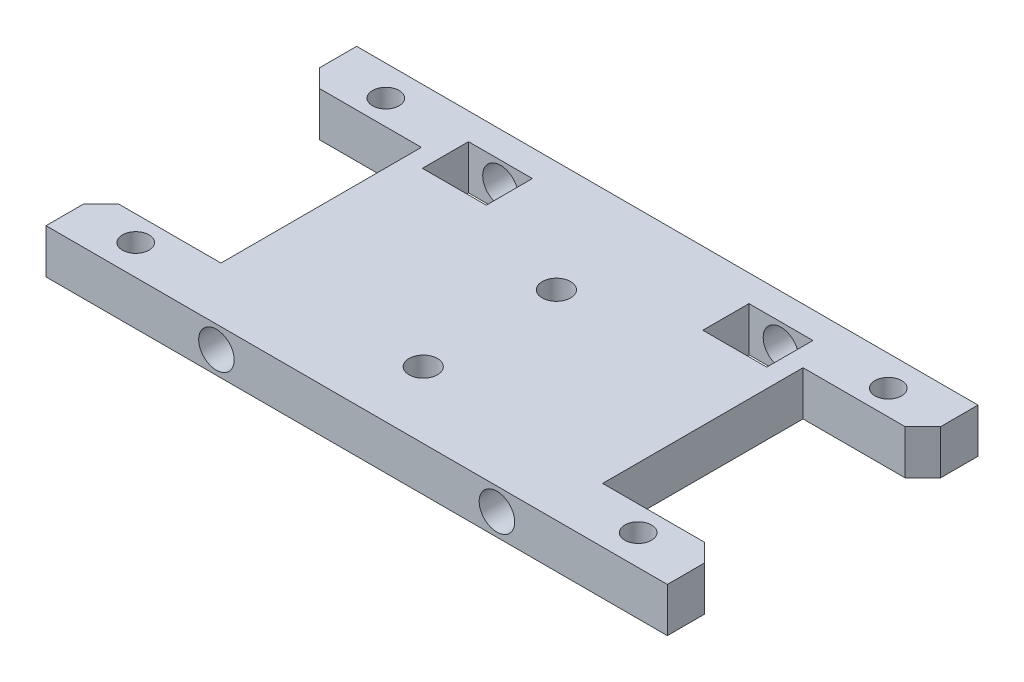
ISO-10303-21;
HEADER;
FILE_DESCRIPTION(('STEP AP214'),'2;1');
FILE_NAME('part.step','',(''),(''),'','','');
FILE_SCHEMA(('AUTOMOTIVE_DESIGN { 1 0 10303 214 1 1 1 1 }'));
ENDSEC;
DATA;
#1=APPLICATION_CONTEXT('core data for automotive mechanical design processes');
#2=APPLICATION_PROTOCOL_DEFINITION('international standard','automotive_design',2000,#1);
#3=PRODUCT_CONTEXT('',#1,'mechanical');
#4=PRODUCT('Part','Part','',(#3));
#5=PRODUCT_RELATED_PRODUCT_CATEGORY('part','',(#4));
#6=PRODUCT_DEFINITION_FORMATION('','',#4);
#7=PRODUCT_DEFINITION_CONTEXT('part definition',#1,'design');
#8=PRODUCT_DEFINITION('design','',#6,#7);
#9=PRODUCT_DEFINITION_SHAPE('','',#8);
#10=(LENGTH_UNIT() NAMED_UNIT(*) SI_UNIT(.MILLI.,.METRE.));
#11=(NAMED_UNIT(*) PLANE_ANGLE_UNIT() SI_UNIT($,.RADIAN.));
#12=(NAMED_UNIT(*) SI_UNIT($,.STERADIAN.) SOLID_ANGLE_UNIT());
#13=UNCERTAINTY_MEASURE_WITH_UNIT(LENGTH_MEASURE(1.E-05),#10,'distance_accuracy_value','');
#14=(GEOMETRIC_REPRESENTATION_CONTEXT(3) GLOBAL_UNCERTAINTY_ASSIGNED_CONTEXT((#13)) GLOBAL_UNIT_ASSIGNED_CONTEXT((#10,
#11,#12)) REPRESENTATION_CONTEXT('',''));
#15=CARTESIAN_POINT('',(0.,0.,0.));
#16=DIRECTION('',(0.,0.,1.));
#17=DIRECTION('',(1.,0.,0.));
#18=AXIS2_PLACEMENT_3D('',#15,#16,#17);
#19=CARTESIAN_POINT('',(-15.8,2.5,-17.5));
#20=DIRECTION('',(0.,0.,1.));
#21=DIRECTION('',(1.,0.,0.));
#22=AXIS2_PLACEMENT_3D('',#19,#20,#21);
#23=CYLINDRICAL_SURFACE('',#22,2.);
#24=CARTESIAN_POINT('',(-15.8,2.5,-9.3));
#25=DIRECTION('',(0.,0.,1.));
#26=DIRECTION('',(1.,0.,0.));
#27=AXIS2_PLACEMENT_3D('',#24,#25,#26);
#28=CIRCLE('',#27,2.);
#29=CARTESIAN_POINT('',(-13.8,2.5,-9.3));
#30=VERTEX_POINT('',#29);
#31=EDGE_CURVE('E43',#30,#30,#28,.F.);
#32=ORIENTED_EDGE('',*,*,#31,.T.);
#33=EDGE_LOOP('',(#32));
#34=FACE_BOUND('',#33,.T.);
#35=CARTESIAN_POINT('',(-15.8,2.5,17.5));
#36=DIRECTION('',(0.,0.,1.));
#37=DIRECTION('',(1.,0.,0.));
#38=AXIS2_PLACEMENT_3D('',#35,#36,#37);
#39=CIRCLE('',#38,2.);
#40=CARTESIAN_POINT('',(-13.8,2.5,17.5));
#41=VERTEX_POINT('',#40);
#42=EDGE_CURVE('E279',#41,#41,#39,.T.);
#43=ORIENTED_EDGE('',*,*,#42,.T.);
#44=EDGE_LOOP('',(#43));
#45=FACE_BOUND('',#44,.T.);
#46=ADVANCED_FACE('F38',(#34,#45),#23,.F.);
#47=CARTESIAN_POINT('',(15.8,2.5,-17.5));
#48=DIRECTION('',(0.,0.,1.));
#49=DIRECTION('',(1.,0.,0.));
#50=AXIS2_PLACEMENT_3D('',#47,#48,#49);
#51=CYLINDRICAL_SURFACE('',#50,2.);
#52=CARTESIAN_POINT('',(15.8,2.5,-9.3));
#53=DIRECTION('',(0.,0.,1.));
#54=DIRECTION('',(1.,0.,0.));
#55=AXIS2_PLACEMENT_3D('',#52,#53,#54);
#56=CIRCLE('',#55,2.);
#57=CARTESIAN_POINT('',(17.8,2.5,-9.3));
#58=VERTEX_POINT('',#57);
#59=EDGE_CURVE('E438',#58,#58,#56,.T.);
#60=ORIENTED_EDGE('',*,*,#59,.F.);
#61=EDGE_LOOP('',(#60));
#62=FACE_BOUND('',#61,.T.);
#63=CARTESIAN_POINT('',(15.8,2.5,17.5));
#64=DIRECTION('',(0.,0.,-1.));
#65=DIRECTION('',(-1.,0.,0.));
#66=AXIS2_PLACEMENT_3D('',#63,#64,#65);
#67=CIRCLE('',#66,2.);
#68=CARTESIAN_POINT('',(13.8,2.5,17.5));
#69=VERTEX_POINT('',#68);
#70=EDGE_CURVE('E276',#69,#69,#67,.T.);
#71=ORIENTED_EDGE('',*,*,#70,.F.);
#72=EDGE_LOOP('',(#71));
#73=FACE_BOUND('',#72,.T.);
#74=ADVANCED_FACE('F464',(#62,#73),#51,.F.);
#75=CARTESIAN_POINT('',(0.,5.,-17.5));
#76=DIRECTION('',(0.,0.,-1.));
#77=DIRECTION('',(-1.,0.,0.));
#78=AXIS2_PLACEMENT_3D('',#75,#76,#77);
#79=PLANE('',#78);
#80=DIRECTION('',(1.,0.,0.));
#81=VECTOR('',#80,1.);
#82=CARTESIAN_POINT('',(0.,0.,-17.5));
#83=LINE('',#82,#81);
#84=CARTESIAN_POINT('',(-35.,0.,-17.5));
#85=VERTEX_POINT('',#84);
#86=CARTESIAN_POINT('',(35.,0.,-17.5));
#87=VERTEX_POINT('',#86);
#88=EDGE_CURVE('E360',#85,#87,#83,.T.);
#89=ORIENTED_EDGE('',*,*,#88,.F.);
#90=DIRECTION('',(0.,-1.,0.));
#91=VECTOR('',#90,1.);
#92=CARTESIAN_POINT('',(-35.,5.,-17.5));
#93=LINE('',#92,#91);
#94=CARTESIAN_POINT('',(-35.,5.,-17.5));
#95=VERTEX_POINT('',#94);
#96=EDGE_CURVE('E395',#95,#85,#93,.T.);
#97=ORIENTED_EDGE('',*,*,#96,.F.);
#98=DIRECTION('',(1.,0.,0.));
#99=VECTOR('',#98,1.);
#100=CARTESIAN_POINT('',(0.,5.,-17.5));
#101=LINE('',#100,#99);
#102=CARTESIAN_POINT('',(35.,5.,-17.5));
#103=VERTEX_POINT('',#102);
#104=EDGE_CURVE('E310',#95,#103,#101,.T.);
#105=ORIENTED_EDGE('',*,*,#104,.T.);
#106=DIRECTION('',(0.,-1.,0.));
#107=VECTOR('',#106,1.);
#108=CARTESIAN_POINT('',(35.,5.,-17.5));
#109=LINE('',#108,#107);
#110=EDGE_CURVE('E397',#103,#87,#109,.T.);
#111=ORIENTED_EDGE('',*,*,#110,.T.);
#112=EDGE_LOOP('',(#89,#97,#105,#111));
#113=FACE_BOUND('',#112,.T.);
#114=CARTESIAN_POINT('',(-15.8,2.5,-17.5));
#115=DIRECTION('',(0.,0.,1.));
#116=DIRECTION('',(1.,0.,0.));
#117=AXIS2_PLACEMENT_3D('',#114,#115,#116);
#118=CIRCLE('',#117,2.);
#119=CARTESIAN_POINT('',(-13.8,2.5,-17.5));
#120=VERTEX_POINT('',#119);
#121=EDGE_CURVE('E282',#120,#120,#118,.T.);
#122=ORIENTED_EDGE('',*,*,#121,.T.);
#123=EDGE_LOOP('',(#122));
#124=FACE_BOUND('',#123,.T.);
#125=CARTESIAN_POINT('',(15.8,2.5,-17.5));
#126=DIRECTION('',(0.,0.,-1.));
#127=DIRECTION('',(-1.,0.,0.));
#128=AXIS2_PLACEMENT_3D('',#125,#126,#127);
#129=CIRCLE('',#128,2.);
#130=CARTESIAN_POINT('',(13.8,2.5,-17.5));
#131=VERTEX_POINT('',#130);
#132=EDGE_CURVE('E272',#131,#131,#129,.T.);
#133=ORIENTED_EDGE('',*,*,#132,.F.);
#134=EDGE_LOOP('',(#133));
#135=FACE_BOUND('',#134,.T.);
#136=ADVANCED_FACE('F470',(#113,#124,#135),#79,.T.);
#137=CARTESIAN_POINT('',(0.,5.,17.5));
#138=DIRECTION('',(0.,0.,-1.));
#139=DIRECTION('',(-1.,0.,0.));
#140=AXIS2_PLACEMENT_3D('',#137,#138,#139);
#141=PLANE('',#140);
#142=ORIENTED_EDGE('',*,*,#42,.F.);
#143=EDGE_LOOP('',(#142));
#144=FACE_BOUND('',#143,.T.);
#145=DIRECTION('',(1.,0.,0.));
#146=VECTOR('',#145,1.);
#147=CARTESIAN_POINT('',(0.,0.,17.5));
#148=LINE('',#147,#146);
#149=CARTESIAN_POINT('',(-35.,0.,17.5));
#150=VERTEX_POINT('',#149);
#151=CARTESIAN_POINT('',(35.,0.,17.5));
#152=VERTEX_POINT('',#151);
#153=EDGE_CURVE('E377',#150,#152,#148,.T.);
#154=ORIENTED_EDGE('',*,*,#153,.T.);
#155=DIRECTION('',(0.,-1.,0.));
#156=VECTOR('',#155,1.);
#157=CARTESIAN_POINT('',(35.,5.,17.5));
#158=LINE('',#157,#156);
#159=CARTESIAN_POINT('',(35.,5.,17.5));
#160=VERTEX_POINT('',#159);
#161=EDGE_CURVE('E336',#160,#152,#158,.T.);
#162=ORIENTED_EDGE('',*,*,#161,.F.);
#163=DIRECTION('',(1.,0.,0.));
#164=VECTOR('',#163,1.);
#165=CARTESIAN_POINT('',(0.,5.,17.5));
#166=LINE('',#165,#164);
#167=CARTESIAN_POINT('',(-35.,5.,17.5));
#168=VERTEX_POINT('',#167);
#169=EDGE_CURVE('E327',#168,#160,#166,.T.);
#170=ORIENTED_EDGE('',*,*,#169,.F.);
#171=DIRECTION('',(0.,-1.,0.));
#172=VECTOR('',#171,1.);
#173=CARTESIAN_POINT('',(-35.,5.,17.5));
#174=LINE('',#173,#172);
#175=EDGE_CURVE('E387',#168,#150,#174,.T.);
#176=ORIENTED_EDGE('',*,*,#175,.T.);
#177=EDGE_LOOP('',(#154,#162,#170,#176));
#178=FACE_BOUND('',#177,.T.);
#179=ORIENTED_EDGE('',*,*,#70,.T.);
#180=EDGE_LOOP('',(#179));
#181=FACE_BOUND('',#180,.T.);
#182=ADVANCED_FACE('F489',(#144,#178,#181),#141,.F.);
#183=CARTESIAN_POINT('',(0.,5.,11.2885966736073));
#184=DIRECTION('',(0.,0.,-1.));
#185=DIRECTION('',(-1.,0.,0.));
#186=AXIS2_PLACEMENT_3D('',#183,#184,#185);
#187=PLANE('',#186);
#188=DIRECTION('',(1.,0.,0.));
#189=VECTOR('',#188,1.);
#190=CARTESIAN_POINT('',(0.,5.,11.2885966736073));
#191=LINE('',#190,#189);
#192=CARTESIAN_POINT('',(21.499999989902,5.,11.2885966736073));
#193=VERTEX_POINT('',#192);
#194=CARTESIAN_POINT('',(33.,5.,11.2885966736073));
#195=VERTEX_POINT('',#194);
#196=EDGE_CURVE('E298',#193,#195,#191,.T.);
#197=ORIENTED_EDGE('',*,*,#196,.T.);
#198=DIRECTION('',(0.,-1.,0.));
#199=VECTOR('',#198,1.);
#200=CARTESIAN_POINT('',(33.,5.,11.2885966736073));
#201=LINE('',#200,#199);
#202=CARTESIAN_POINT('',(33.,0.,11.2885966736073));
#203=VERTEX_POINT('',#202);
#204=EDGE_CURVE('E403',#195,#203,#201,.T.);
#205=ORIENTED_EDGE('',*,*,#204,.T.);
#206=DIRECTION('',(1.,0.,0.));
#207=VECTOR('',#206,1.);
#208=CARTESIAN_POINT('',(0.,0.,11.2885966736073));
#209=LINE('',#208,#207);
#210=CARTESIAN_POINT('',(21.499999989902,0.,11.2885966736073));
#211=VERTEX_POINT('',#210);
#212=EDGE_CURVE('E348',#211,#203,#209,.T.);
#213=ORIENTED_EDGE('',*,*,#212,.F.);
#214=DIRECTION('',(0.,-1.,0.));
#215=VECTOR('',#214,1.);
#216=CARTESIAN_POINT('',(21.499999989902,5.,11.2885966736073));
#217=LINE('',#216,#215);
#218=EDGE_CURVE('E401',#193,#211,#217,.T.);
#219=ORIENTED_EDGE('',*,*,#218,.F.);
#220=EDGE_LOOP('',(#197,#205,#213,#219));
#221=FACE_BOUND('',#220,.T.);
#222=ADVANCED_FACE('F497',(#221),#187,.T.);
#223=CARTESIAN_POINT('',(21.499999989902,5.,0.));
#224=DIRECTION('',(1.,0.,0.));
#225=DIRECTION('',(0.,0.,-1.));
#226=AXIS2_PLACEMENT_3D('',#223,#224,#225);
#227=PLANE('',#226);
#228=DIRECTION('',(0.,0.,1.));
#229=VECTOR('',#228,1.);
#230=CARTESIAN_POINT('',(21.499999989902,0.,0.));
#231=LINE('',#230,#229);
#232=CARTESIAN_POINT('',(21.499999989902,0.,-11.2885966736073));
#233=VERTEX_POINT('',#232);
#234=EDGE_CURVE('E351',#233,#211,#231,.T.);
#235=ORIENTED_EDGE('',*,*,#234,.F.);
#236=DIRECTION('',(0.,-1.,0.));
#237=VECTOR('',#236,1.);
#238=CARTESIAN_POINT('',(21.499999989902,5.,-11.2885966736073));
#239=LINE('',#238,#237);
#240=CARTESIAN_POINT('',(21.499999989902,5.,-11.2885966736073));
#241=VERTEX_POINT('',#240);
#242=EDGE_CURVE('E399',#241,#233,#239,.T.);
#243=ORIENTED_EDGE('',*,*,#242,.F.);
#244=DIRECTION('',(0.,0.,1.));
#245=VECTOR('',#244,1.);
#246=CARTESIAN_POINT('',(21.499999989902,5.,0.));
#247=LINE('',#246,#245);
#248=EDGE_CURVE('E301',#241,#193,#247,.T.);
#249=ORIENTED_EDGE('',*,*,#248,.T.);
#250=ORIENTED_EDGE('',*,*,#218,.T.);
#251=EDGE_LOOP('',(#235,#243,#249,#250));
#252=FACE_BOUND('',#251,.T.);
#253=ADVANCED_FACE('F509',(#252),#227,.T.);
#254=CARTESIAN_POINT('',(0.,5.,-11.2885966736073));
#255=DIRECTION('',(0.,0.,-1.));
#256=DIRECTION('',(-1.,0.,0.));
#257=AXIS2_PLACEMENT_3D('',#254,#255,#256);
#258=PLANE('',#257);
#259=DIRECTION('',(1.,0.,0.));
#260=VECTOR('',#259,1.);
#261=CARTESIAN_POINT('',(0.,0.,-11.2885966736073));
#262=LINE('',#261,#260);
#263=CARTESIAN_POINT('',(33.,0.,-11.2885966736073));
#264=VERTEX_POINT('',#263);
#265=EDGE_CURVE('E354',#233,#264,#262,.T.);
#266=ORIENTED_EDGE('',*,*,#265,.T.);
#267=DIRECTION('',(0.,1.,0.));
#268=VECTOR('',#267,1.);
#269=CARTESIAN_POINT('',(33.,5.,-11.2885966736073));
#270=LINE('',#269,#268);
#271=CARTESIAN_POINT('',(33.,5.,-11.2885966736073));
#272=VERTEX_POINT('',#271);
#273=EDGE_CURVE('E427',#264,#272,#270,.T.);
#274=ORIENTED_EDGE('',*,*,#273,.T.);
#275=DIRECTION('',(1.,0.,0.));
#276=VECTOR('',#275,1.);
#277=CARTESIAN_POINT('',(0.,5.,-11.2885966736073));
#278=LINE('',#277,#276);
#279=EDGE_CURVE('E304',#241,#272,#278,.T.);
#280=ORIENTED_EDGE('',*,*,#279,.F.);
#281=ORIENTED_EDGE('',*,*,#242,.T.);
#282=EDGE_LOOP('',(#266,#274,#280,#281));
#283=FACE_BOUND('',#282,.T.);
#284=ADVANCED_FACE('F505',(#283),#258,.F.);
#285=CARTESIAN_POINT('',(35.,5.,0.));
#286=DIRECTION('',(1.,0.,0.));
#287=DIRECTION('',(0.,0.,-1.));
#288=AXIS2_PLACEMENT_3D('',#285,#286,#287);
#289=PLANE('',#288);
#290=DIRECTION('',(0.,0.,1.));
#291=VECTOR('',#290,1.);
#292=CARTESIAN_POINT('',(35.,5.,0.));
#293=LINE('',#292,#291);
#294=CARTESIAN_POINT('',(35.,5.,-13.2885966736073));
#295=VERTEX_POINT('',#294);
#296=EDGE_CURVE('E307',#103,#295,#293,.T.);
#297=ORIENTED_EDGE('',*,*,#296,.T.);
#298=DIRECTION('',(0.,-1.,0.));
#299=VECTOR('',#298,1.);
#300=CARTESIAN_POINT('',(35.,0.,-13.2885966736073));
#301=LINE('',#300,#299);
#302=CARTESIAN_POINT('',(35.,0.,-13.2885966736073));
#303=VERTEX_POINT('',#302);
#304=EDGE_CURVE('E424',#295,#303,#301,.T.);
#305=ORIENTED_EDGE('',*,*,#304,.T.);
#306=DIRECTION('',(0.,0.,1.));
#307=VECTOR('',#306,1.);
#308=CARTESIAN_POINT('',(35.,0.,0.));
#309=LINE('',#308,#307);
#310=EDGE_CURVE('E357',#87,#303,#309,.T.);
#311=ORIENTED_EDGE('',*,*,#310,.F.);
#312=ORIENTED_EDGE('',*,*,#110,.F.);
#313=EDGE_LOOP('',(#297,#305,#311,#312));
#314=FACE_BOUND('',#313,.T.);
#315=ADVANCED_FACE('F508',(#314),#289,.T.);
#316=CARTESIAN_POINT('',(-35.,5.,0.));
#317=DIRECTION('',(1.,0.,0.));
#318=DIRECTION('',(0.,0.,-1.));
#319=AXIS2_PLACEMENT_3D('',#316,#317,#318);
#320=PLANE('',#319);
#321=DIRECTION('',(0.,0.,1.));
#322=VECTOR('',#321,1.);
#323=CARTESIAN_POINT('',(-35.,0.,0.));
#324=LINE('',#323,#322);
#325=CARTESIAN_POINT('',(-35.,0.,-13.2885966736073));
#326=VERTEX_POINT('',#325);
#327=EDGE_CURVE('E364',#85,#326,#324,.T.);
#328=ORIENTED_EDGE('',*,*,#327,.T.);
#329=DIRECTION('',(0.,1.,0.));
#330=VECTOR('',#329,1.);
#331=CARTESIAN_POINT('',(-35.,5.,-13.2885966736073));
#332=LINE('',#331,#330);
#333=CARTESIAN_POINT('',(-35.,5.,-13.2885966736073));
#334=VERTEX_POINT('',#333);
#335=EDGE_CURVE('E11',#326,#334,#332,.T.);
#336=ORIENTED_EDGE('',*,*,#335,.T.);
#337=DIRECTION('',(0.,0.,1.));
#338=VECTOR('',#337,1.);
#339=CARTESIAN_POINT('',(-35.,5.,0.));
#340=LINE('',#339,#338);
#341=EDGE_CURVE('E314',#95,#334,#340,.T.);
#342=ORIENTED_EDGE('',*,*,#341,.F.);
#343=ORIENTED_EDGE('',*,*,#96,.T.);
#344=EDGE_LOOP('',(#328,#336,#342,#343));
#345=FACE_BOUND('',#344,.T.);
#346=ADVANCED_FACE('F616',(#345),#320,.F.);
#347=CARTESIAN_POINT('',(0.,5.,-11.2885966736073));
#348=DIRECTION('',(0.,0.,1.));
#349=DIRECTION('',(1.,0.,0.));
#350=AXIS2_PLACEMENT_3D('',#347,#348,#349);
#351=PLANE('',#350);
#352=DIRECTION('',(-1.,0.,0.));
#353=VECTOR('',#352,1.);
#354=CARTESIAN_POINT('',(0.,5.,-11.2885966736073));
#355=LINE('',#354,#353);
#356=CARTESIAN_POINT('',(-21.499999989902,5.,-11.2885966736073));
#357=VERTEX_POINT('',#356);
#358=CARTESIAN_POINT('',(-33.,5.,-11.2885966736073));
#359=VERTEX_POINT('',#358);
#360=EDGE_CURVE('E317',#357,#359,#355,.T.);
#361=ORIENTED_EDGE('',*,*,#360,.T.);
#362=DIRECTION('',(0.,-1.,0.));
#363=VECTOR('',#362,1.);
#364=CARTESIAN_POINT('',(-33.,0.,-11.2885966736073));
#365=LINE('',#364,#363);
#366=CARTESIAN_POINT('',(-33.,0.,-11.2885966736073));
#367=VERTEX_POINT('',#366);
#368=EDGE_CURVE('E48',#359,#367,#365,.T.);
#369=ORIENTED_EDGE('',*,*,#368,.T.);
#370=DIRECTION('',(-1.,0.,0.));
#371=VECTOR('',#370,1.);
#372=CARTESIAN_POINT('',(0.,0.,-11.2885966736073));
#373=LINE('',#372,#371);
#374=CARTESIAN_POINT('',(-21.499999989902,0.,-11.2885966736073));
#375=VERTEX_POINT('',#374);
#376=EDGE_CURVE('E367',#375,#367,#373,.T.);
#377=ORIENTED_EDGE('',*,*,#376,.F.);
#378=DIRECTION('',(0.,-1.,0.));
#379=VECTOR('',#378,1.);
#380=CARTESIAN_POINT('',(-21.499999989902,5.,-11.2885966736073));
#381=LINE('',#380,#379);
#382=EDGE_CURVE('E393',#357,#375,#381,.T.);
#383=ORIENTED_EDGE('',*,*,#382,.F.);
#384=EDGE_LOOP('',(#361,#369,#377,#383));
#385=FACE_BOUND('',#384,.T.);
#386=ADVANCED_FACE('F503',(#385),#351,.T.);
#387=CARTESIAN_POINT('',(-21.499999989902,5.,0.));
#388=DIRECTION('',(1.,0.,0.));
#389=DIRECTION('',(0.,0.,-1.));
#390=AXIS2_PLACEMENT_3D('',#387,#388,#389);
#391=PLANE('',#390);
#392=DIRECTION('',(0.,0.,1.));
#393=VECTOR('',#392,1.);
#394=CARTESIAN_POINT('',(-21.499999989902,0.,0.));
#395=LINE('',#394,#393);
#396=CARTESIAN_POINT('',(-21.499999989902,0.,11.2885966736073));
#397=VERTEX_POINT('',#396);
#398=EDGE_CURVE('E371',#375,#397,#395,.T.);
#399=ORIENTED_EDGE('',*,*,#398,.T.);
#400=DIRECTION('',(0.,-1.,0.));
#401=VECTOR('',#400,1.);
#402=CARTESIAN_POINT('',(-21.499999989902,5.,11.2885966736073));
#403=LINE('',#402,#401);
#404=CARTESIAN_POINT('',(-21.499999989902,5.,11.2885966736073));
#405=VERTEX_POINT('',#404);
#406=EDGE_CURVE('E390',#405,#397,#403,.T.);
#407=ORIENTED_EDGE('',*,*,#406,.F.);
#408=DIRECTION('',(0.,0.,1.));
#409=VECTOR('',#408,1.);
#410=CARTESIAN_POINT('',(-21.499999989902,5.,0.));
#411=LINE('',#410,#409);
#412=EDGE_CURVE('E321',#357,#405,#411,.T.);
#413=ORIENTED_EDGE('',*,*,#412,.F.);
#414=ORIENTED_EDGE('',*,*,#382,.T.);
#415=EDGE_LOOP('',(#399,#407,#413,#414));
#416=FACE_BOUND('',#415,.T.);
#417=ADVANCED_FACE('F604',(#416),#391,.F.);
#418=CARTESIAN_POINT('',(0.,5.,11.2885966736073));
#419=DIRECTION('',(0.,0.,1.));
#420=DIRECTION('',(1.,0.,0.));
#421=AXIS2_PLACEMENT_3D('',#418,#419,#420);
#422=PLANE('',#421);
#423=DIRECTION('',(-1.,0.,0.));
#424=VECTOR('',#423,1.);
#425=CARTESIAN_POINT('',(0.,0.,11.2885966736073));
#426=LINE('',#425,#424);
#427=CARTESIAN_POINT('',(-33.,0.,11.2885966736073));
#428=VERTEX_POINT('',#427);
#429=EDGE_CURVE('E374',#397,#428,#426,.T.);
#430=ORIENTED_EDGE('',*,*,#429,.T.);
#431=DIRECTION('',(0.,1.,0.));
#432=VECTOR('',#431,1.);
#433=CARTESIAN_POINT('',(-33.,5.,11.2885966736073));
#434=LINE('',#433,#432);
#435=CARTESIAN_POINT('',(-33.,5.,11.2885966736073));
#436=VERTEX_POINT('',#435);
#437=EDGE_CURVE('E432',#428,#436,#434,.T.);
#438=ORIENTED_EDGE('',*,*,#437,.T.);
#439=DIRECTION('',(-1.,0.,0.));
#440=VECTOR('',#439,1.);
#441=CARTESIAN_POINT('',(0.,5.,11.2885966736073));
#442=LINE('',#441,#440);
#443=EDGE_CURVE('E324',#405,#436,#442,.T.);
#444=ORIENTED_EDGE('',*,*,#443,.F.);
#445=ORIENTED_EDGE('',*,*,#406,.T.);
#446=EDGE_LOOP('',(#430,#438,#444,#445));
#447=FACE_BOUND('',#446,.T.);
#448=ADVANCED_FACE('F607',(#447),#422,.F.);
#449=CARTESIAN_POINT('',(-35.,5.,13.2885966736073));
#450=VERTEX_POINT('',#449);
#451=EDGE_CURVE('E318',#450,#168,#340,.T.);
#452=ORIENTED_EDGE('',*,*,#451,.F.);
#453=DIRECTION('',(0.,-1.,0.));
#454=VECTOR('',#453,1.);
#455=CARTESIAN_POINT('',(-35.,5.,13.2885966736073));
#456=LINE('',#455,#454);
#457=CARTESIAN_POINT('',(-35.,0.,13.2885966736073));
#458=VERTEX_POINT('',#457);
#459=EDGE_CURVE('E429',#450,#458,#456,.T.);
#460=ORIENTED_EDGE('',*,*,#459,.T.);
#461=EDGE_CURVE('E368',#458,#150,#324,.T.);
#462=ORIENTED_EDGE('',*,*,#461,.T.);
#463=ORIENTED_EDGE('',*,*,#175,.F.);
#464=EDGE_LOOP('',(#452,#460,#462,#463));
#465=FACE_BOUND('',#464,.T.);
#466=ADVANCED_FACE('F566',(#465),#320,.F.);
#467=CARTESIAN_POINT('',(28.3037275007649,5.,14.0885966736073));
#468=DIRECTION('',(0.,-1.,0.));
#469=DIRECTION('',(0.,0.,-1.));
#470=AXIS2_PLACEMENT_3D('',#467,#468,#469);
#471=CYLINDRICAL_SURFACE('',#470,1.5);
#472=CARTESIAN_POINT('',(28.3037275007649,5.,14.0885966736073));
#473=DIRECTION('',(0.,1.,0.));
#474=DIRECTION('',(0.,0.,1.));
#475=AXIS2_PLACEMENT_3D('',#472,#473,#474);
#476=CIRCLE('',#475,1.5);
#477=CARTESIAN_POINT('',(28.3037275007649,5.,15.5885966736073));
#478=VERTEX_POINT('',#477);
#479=EDGE_CURVE('E330',#478,#478,#476,.T.);
#480=ORIENTED_EDGE('',*,*,#479,.T.);
#481=EDGE_LOOP('',(#480));
#482=FACE_BOUND('',#481,.T.);
#483=CARTESIAN_POINT('',(28.3037275007649,0.,14.0885966736073));
#484=DIRECTION('',(0.,1.,0.));
#485=DIRECTION('',(0.,0.,1.));
#486=AXIS2_PLACEMENT_3D('',#483,#484,#485);
#487=CIRCLE('',#486,1.5);
#488=CARTESIAN_POINT('',(28.3037275007649,0.,15.5885966736073));
#489=VERTEX_POINT('',#488);
#490=EDGE_CURVE('E380',#489,#489,#487,.T.);
#491=ORIENTED_EDGE('',*,*,#490,.F.);
#492=EDGE_LOOP('',(#491));
#493=FACE_BOUND('',#492,.T.);
#494=ADVANCED_FACE('F614',(#482,#493),#471,.F.);
#495=CARTESIAN_POINT('',(35.,0.,13.2885966736073));
#496=VERTEX_POINT('',#495);
#497=EDGE_CURVE('E361',#496,#152,#309,.T.);
#498=ORIENTED_EDGE('',*,*,#497,.F.);
#499=DIRECTION('',(0.,1.,0.));
#500=VECTOR('',#499,1.);
#501=CARTESIAN_POINT('',(35.,5.,13.2885966736073));
#502=LINE('',#501,#500);
#503=CARTESIAN_POINT('',(35.,5.,13.2885966736073));
#504=VERTEX_POINT('',#503);
#505=EDGE_CURVE('E414',#496,#504,#502,.T.);
#506=ORIENTED_EDGE('',*,*,#505,.T.);
#507=EDGE_CURVE('E311',#504,#160,#293,.T.);
#508=ORIENTED_EDGE('',*,*,#507,.T.);
#509=ORIENTED_EDGE('',*,*,#161,.T.);
#510=EDGE_LOOP('',(#498,#506,#508,#509));
#511=FACE_BOUND('',#510,.T.);
#512=ADVANCED_FACE('F521',(#511),#289,.T.);
#513=CARTESIAN_POINT('',(-28.3037275007649,5.,-14.0885966736073));
#514=DIRECTION('',(0.,-1.,0.));
#515=DIRECTION('',(0.,0.,-1.));
#516=AXIS2_PLACEMENT_3D('',#513,#514,#515);
#517=CYLINDRICAL_SURFACE('',#516,1.5);
#518=CARTESIAN_POINT('',(-28.3037275007649,5.,-14.0885966736073));
#519=DIRECTION('',(0.,1.,0.));
#520=DIRECTION('',(0.,0.,1.));
#521=AXIS2_PLACEMENT_3D('',#518,#519,#520);
#522=CIRCLE('',#521,1.5);
#523=CARTESIAN_POINT('',(-28.3037275007649,5.,-12.5885966736073));
#524=VERTEX_POINT('',#523);
#525=EDGE_CURVE('E295',#524,#524,#522,.T.);
#526=ORIENTED_EDGE('',*,*,#525,.T.);
#527=EDGE_LOOP('',(#526));
#528=FACE_BOUND('',#527,.T.);
#529=CARTESIAN_POINT('',(-28.3037275007649,0.,-14.0885966736073));
#530=DIRECTION('',(0.,1.,0.));
#531=DIRECTION('',(0.,0.,1.));
#532=AXIS2_PLACEMENT_3D('',#529,#530,#531);
#533=CIRCLE('',#532,1.5);
#534=CARTESIAN_POINT('',(-28.3037275007649,0.,-12.5885966736073));
#535=VERTEX_POINT('',#534);
#536=EDGE_CURVE('E345',#535,#535,#533,.T.);
#537=ORIENTED_EDGE('',*,*,#536,.F.);
#538=EDGE_LOOP('',(#537));
#539=FACE_BOUND('',#538,.T.);
#540=ADVANCED_FACE('F517',(#528,#539),#517,.F.);
#541=CARTESIAN_POINT('',(-28.3037275007649,5.,14.0885966736073));
#542=DIRECTION('',(0.,-1.,0.));
#543=DIRECTION('',(0.,0.,-1.));
#544=AXIS2_PLACEMENT_3D('',#541,#542,#543);
#545=CYLINDRICAL_SURFACE('',#544,1.5);
#546=CARTESIAN_POINT('',(-28.3037275007649,5.,14.0885966736073));
#547=DIRECTION('',(0.,1.,0.));
#548=DIRECTION('',(0.,0.,1.));
#549=AXIS2_PLACEMENT_3D('',#546,#547,#548);
#550=CIRCLE('',#549,1.5);
#551=CARTESIAN_POINT('',(-28.3037275007649,5.,15.5885966736073));
#552=VERTEX_POINT('',#551);
#553=EDGE_CURVE('E292',#552,#552,#550,.F.);
#554=ORIENTED_EDGE('',*,*,#553,.F.);
#555=EDGE_LOOP('',(#554));
#556=FACE_BOUND('',#555,.T.);
#557=CARTESIAN_POINT('',(-28.3037275007649,0.,14.0885966736073));
#558=DIRECTION('',(0.,1.,0.));
#559=DIRECTION('',(0.,0.,1.));
#560=AXIS2_PLACEMENT_3D('',#557,#558,#559);
#561=CIRCLE('',#560,1.5);
#562=CARTESIAN_POINT('',(-28.3037275007649,0.,15.5885966736073));
#563=VERTEX_POINT('',#562);
#564=EDGE_CURVE('E342',#563,#563,#561,.F.);
#565=ORIENTED_EDGE('',*,*,#564,.T.);
#566=EDGE_LOOP('',(#565));
#567=FACE_BOUND('',#566,.T.);
#568=ADVANCED_FACE('F520',(#556,#567),#545,.F.);
#569=CARTESIAN_POINT('',(0.,5.,10.));
#570=DIRECTION('',(0.,-1.,0.));
#571=DIRECTION('',(0.,0.,-1.));
#572=AXIS2_PLACEMENT_3D('',#569,#570,#571);
#573=CYLINDRICAL_SURFACE('',#572,1.6);
#574=CARTESIAN_POINT('',(0.,5.,10.));
#575=DIRECTION('',(0.,1.,0.));
#576=DIRECTION('',(0.,0.,1.));
#577=AXIS2_PLACEMENT_3D('',#574,#575,#576);
#578=CIRCLE('',#577,1.6);
#579=CARTESIAN_POINT('',(0.,5.,11.6));
#580=VERTEX_POINT('',#579);
#581=EDGE_CURVE('E288',#580,#580,#578,.T.);
#582=ORIENTED_EDGE('',*,*,#581,.T.);
#583=EDGE_LOOP('',(#582));
#584=FACE_BOUND('',#583,.T.);
#585=CARTESIAN_POINT('',(0.,0.,10.));
#586=DIRECTION('',(0.,1.,0.));
#587=DIRECTION('',(0.,0.,1.));
#588=AXIS2_PLACEMENT_3D('',#585,#586,#587);
#589=CIRCLE('',#588,1.6);
#590=CARTESIAN_POINT('',(0.,0.,11.6));
#591=VERTEX_POINT('',#590);
#592=EDGE_CURVE('E339',#591,#591,#589,.T.);
#593=ORIENTED_EDGE('',*,*,#592,.F.);
#594=EDGE_LOOP('',(#593));
#595=FACE_BOUND('',#594,.T.);
#596=ADVANCED_FACE('F525',(#584,#595),#573,.F.);
#597=CARTESIAN_POINT('',(0.,5.,-5.));
#598=DIRECTION('',(0.,-1.,0.));
#599=DIRECTION('',(0.,0.,-1.));
#600=AXIS2_PLACEMENT_3D('',#597,#598,#599);
#601=CYLINDRICAL_SURFACE('',#600,1.6);
#602=CARTESIAN_POINT('',(0.,5.,-5.));
#603=DIRECTION('',(0.,1.,0.));
#604=DIRECTION('',(0.,0.,1.));
#605=AXIS2_PLACEMENT_3D('',#602,#603,#604);
#606=CIRCLE('',#605,1.6);
#607=CARTESIAN_POINT('',(0.,5.,-3.4));
#608=VERTEX_POINT('',#607);
#609=EDGE_CURVE('E285',#608,#608,#606,.T.);
#610=ORIENTED_EDGE('',*,*,#609,.T.);
#611=EDGE_LOOP('',(#610));
#612=FACE_BOUND('',#611,.T.);
#613=CARTESIAN_POINT('',(0.,0.,-5.));
#614=DIRECTION('',(0.,1.,0.));
#615=DIRECTION('',(0.,0.,1.));
#616=AXIS2_PLACEMENT_3D('',#613,#614,#615);
#617=CIRCLE('',#616,1.6);
#618=CARTESIAN_POINT('',(0.,0.,-3.4));
#619=VERTEX_POINT('',#618);
#620=EDGE_CURVE('E275',#619,#619,#617,.T.);
#621=ORIENTED_EDGE('',*,*,#620,.F.);
#622=EDGE_LOOP('',(#621));
#623=FACE_BOUND('',#622,.T.);
#624=ADVANCED_FACE('F529',(#612,#623),#601,.F.);
#625=CARTESIAN_POINT('',(28.3037275007649,5.,-14.0885966736073));
#626=DIRECTION('',(0.,-1.,0.));
#627=DIRECTION('',(0.,0.,-1.));
#628=AXIS2_PLACEMENT_3D('',#625,#626,#627);
#629=CYLINDRICAL_SURFACE('',#628,1.5);
#630=CARTESIAN_POINT('',(28.3037275007649,5.,-14.0885966736073));
#631=DIRECTION('',(0.,1.,0.));
#632=DIRECTION('',(0.,0.,1.));
#633=AXIS2_PLACEMENT_3D('',#630,#631,#632);
#634=CIRCLE('',#633,1.5);
#635=CARTESIAN_POINT('',(28.3037275007649,5.,-12.5885966736073));
#636=VERTEX_POINT('',#635);
#637=EDGE_CURVE('E333',#636,#636,#634,.F.);
#638=ORIENTED_EDGE('',*,*,#637,.F.);
#639=EDGE_LOOP('',(#638));
#640=FACE_BOUND('',#639,.T.);
#641=CARTESIAN_POINT('',(28.3037275007649,0.,-14.0885966736073));
#642=DIRECTION('',(0.,1.,0.));
#643=DIRECTION('',(0.,0.,1.));
#644=AXIS2_PLACEMENT_3D('',#641,#642,#643);
#645=CIRCLE('',#644,1.5);
#646=CARTESIAN_POINT('',(28.3037275007649,0.,-12.5885966736073));
#647=VERTEX_POINT('',#646);
#648=EDGE_CURVE('E289',#647,#647,#645,.F.);
#649=ORIENTED_EDGE('',*,*,#648,.T.);
#650=EDGE_LOOP('',(#649));
#651=FACE_BOUND('',#650,.T.);
#652=ADVANCED_FACE('F533',(#640,#651),#629,.F.);
#653=CARTESIAN_POINT('',(0.,5.,0.));
#654=DIRECTION('',(0.,1.,0.));
#655=DIRECTION('',(0.,0.,1.));
#656=AXIS2_PLACEMENT_3D('',#653,#654,#655);
#657=PLANE('',#656);
#658=DIRECTION('',(0.,0.,-1.));
#659=VECTOR('',#658,1.);
#660=CARTESIAN_POINT('',(-12.2,5.,-14.5));
#661=LINE('',#660,#659);
#662=CARTESIAN_POINT('',(-12.2,5.,-9.3));
#663=VERTEX_POINT('',#662);
#664=CARTESIAN_POINT('',(-12.2,5.,-14.5));
#665=VERTEX_POINT('',#664);
#666=EDGE_CURVE('E56',#663,#665,#661,.T.);
#667=ORIENTED_EDGE('',*,*,#666,.F.);
#668=DIRECTION('',(1.,0.,0.));
#669=VECTOR('',#668,1.);
#670=CARTESIAN_POINT('',(-19.4,5.,-9.3));
#671=LINE('',#670,#669);
#672=CARTESIAN_POINT('',(-19.4,5.,-9.3));
#673=VERTEX_POINT('',#672);
#674=EDGE_CURVE('E223',#673,#663,#671,.T.);
#675=ORIENTED_EDGE('',*,*,#674,.F.);
#676=DIRECTION('',(0.,0.,1.));
#677=VECTOR('',#676,1.);
#678=CARTESIAN_POINT('',(-19.4,5.,-14.5));
#679=LINE('',#678,#677);
#680=CARTESIAN_POINT('',(-19.4,5.,-14.5));
#681=VERTEX_POINT('',#680);
#682=EDGE_CURVE('E226',#681,#673,#679,.T.);
#683=ORIENTED_EDGE('',*,*,#682,.F.);
#684=DIRECTION('',(-1.,0.,0.));
#685=VECTOR('',#684,1.);
#686=CARTESIAN_POINT('',(-19.4,5.,-14.5));
#687=LINE('',#686,#685);
#688=EDGE_CURVE('E232',#665,#681,#687,.T.);
#689=ORIENTED_EDGE('',*,*,#688,.F.);
#690=EDGE_LOOP('',(#667,#675,#683,#689));
#691=FACE_BOUND('',#690,.T.);
#692=DIRECTION('',(0.,0.,-1.));
#693=VECTOR('',#692,1.);
#694=CARTESIAN_POINT('',(19.4,5.,-14.5));
#695=LINE('',#694,#693);
#696=CARTESIAN_POINT('',(19.4,5.,-9.3));
#697=VERTEX_POINT('',#696);
#698=CARTESIAN_POINT('',(19.4,5.,-14.5));
#699=VERTEX_POINT('',#698);
#700=EDGE_CURVE('E64',#697,#699,#695,.T.);
#701=ORIENTED_EDGE('',*,*,#700,.F.);
#702=DIRECTION('',(1.,0.,0.));
#703=VECTOR('',#702,1.);
#704=CARTESIAN_POINT('',(19.4,5.,-9.3));
#705=LINE('',#704,#703);
#706=CARTESIAN_POINT('',(12.2,5.,-9.3));
#707=VERTEX_POINT('',#706);
#708=EDGE_CURVE('E247',#707,#697,#705,.T.);
#709=ORIENTED_EDGE('',*,*,#708,.F.);
#710=DIRECTION('',(0.,0.,1.));
#711=VECTOR('',#710,1.);
#712=CARTESIAN_POINT('',(12.2,5.,-14.5));
#713=LINE('',#712,#711);
#714=CARTESIAN_POINT('',(12.2,5.,-14.5));
#715=VERTEX_POINT('',#714);
#716=EDGE_CURVE('E261',#715,#707,#713,.T.);
#717=ORIENTED_EDGE('',*,*,#716,.F.);
#718=DIRECTION('',(-1.,0.,0.));
#719=VECTOR('',#718,1.);
#720=CARTESIAN_POINT('',(19.4,5.,-14.5));
#721=LINE('',#720,#719);
#722=EDGE_CURVE('E258',#699,#715,#721,.T.);
#723=ORIENTED_EDGE('',*,*,#722,.F.);
#724=EDGE_LOOP('',(#701,#709,#717,#723));
#725=FACE_BOUND('',#724,.T.);
#726=ORIENTED_EDGE('',*,*,#609,.F.);
#727=EDGE_LOOP('',(#726));
#728=FACE_BOUND('',#727,.T.);
#729=ORIENTED_EDGE('',*,*,#581,.F.);
#730=EDGE_LOOP('',(#729));
#731=FACE_BOUND('',#730,.T.);
#732=ORIENTED_EDGE('',*,*,#553,.T.);
#733=EDGE_LOOP('',(#732));
#734=FACE_BOUND('',#733,.T.);
#735=ORIENTED_EDGE('',*,*,#525,.F.);
#736=EDGE_LOOP('',(#735));
#737=FACE_BOUND('',#736,.T.);
#738=ORIENTED_EDGE('',*,*,#507,.F.);
#739=DIRECTION('',(0.707106781186545,0.,0.70710678118655));
#740=VECTOR('',#739,1.);
#741=CARTESIAN_POINT('',(10.8557016631965,5.,-10.8557016631964));
#742=LINE('',#741,#740);
#743=EDGE_CURVE('E422',#504,#195,#742,.F.);
#744=ORIENTED_EDGE('',*,*,#743,.T.);
#745=ORIENTED_EDGE('',*,*,#196,.F.);
#746=ORIENTED_EDGE('',*,*,#248,.F.);
#747=ORIENTED_EDGE('',*,*,#279,.T.);
#748=DIRECTION('',(0.707106781186549,0.,-0.707106781186546));
#749=VECTOR('',#748,1.);
#750=CARTESIAN_POINT('',(10.8557016631963,5.,10.8557016631963));
#751=LINE('',#750,#749);
#752=EDGE_CURVE('E420',#272,#295,#751,.T.);
#753=ORIENTED_EDGE('',*,*,#752,.T.);
#754=ORIENTED_EDGE('',*,*,#296,.F.);
#755=ORIENTED_EDGE('',*,*,#104,.F.);
#756=ORIENTED_EDGE('',*,*,#341,.T.);
#757=DIRECTION('',(0.707106781186545,0.,0.70710678118655));
#758=VECTOR('',#757,1.);
#759=CARTESIAN_POINT('',(-10.8557016631965,5.,10.8557016631964));
#760=LINE('',#759,#758);
#761=EDGE_CURVE('E416',#334,#359,#760,.T.);
#762=ORIENTED_EDGE('',*,*,#761,.T.);
#763=ORIENTED_EDGE('',*,*,#360,.F.);
#764=ORIENTED_EDGE('',*,*,#412,.T.);
#765=ORIENTED_EDGE('',*,*,#443,.T.);
#766=DIRECTION('',(0.707106781186549,0.,-0.707106781186546));
#767=VECTOR('',#766,1.);
#768=CARTESIAN_POINT('',(-10.8557016631963,5.,-10.8557016631963));
#769=LINE('',#768,#767);
#770=EDGE_CURVE('E418',#436,#450,#769,.F.);
#771=ORIENTED_EDGE('',*,*,#770,.T.);
#772=ORIENTED_EDGE('',*,*,#451,.T.);
#773=ORIENTED_EDGE('',*,*,#169,.T.);
#774=EDGE_LOOP('',(#738,#744,#745,#746,#747,#753,#754,#755,#756,#762,#763,#764,#765,#771,#772,#773));
#775=FACE_BOUND('',#774,.T.);
#776=ORIENTED_EDGE('',*,*,#479,.F.);
#777=EDGE_LOOP('',(#776));
#778=FACE_BOUND('',#777,.T.);
#779=ORIENTED_EDGE('',*,*,#637,.T.);
#780=EDGE_LOOP('',(#779));
#781=FACE_BOUND('',#780,.T.);
#782=ADVANCED_FACE('F561',(#691,#725,#728,#731,#734,#737,#775,#778,#781),#657,.T.);
#783=CARTESIAN_POINT('',(0.,0.,0.));
#784=DIRECTION('',(0.,1.,0.));
#785=DIRECTION('',(0.,0.,1.));
#786=AXIS2_PLACEMENT_3D('',#783,#784,#785);
#787=PLANE('',#786);
#788=DIRECTION('',(1.,0.,0.));
#789=VECTOR('',#788,1.);
#790=CARTESIAN_POINT('',(-19.4,0.,-9.3));
#791=LINE('',#790,#789);
#792=CARTESIAN_POINT('',(-19.4,0.,-9.3));
#793=VERTEX_POINT('',#792);
#794=CARTESIAN_POINT('',(-12.2,0.,-9.3));
#795=VERTEX_POINT('',#794);
#796=EDGE_CURVE('E209',#793,#795,#791,.T.);
#797=ORIENTED_EDGE('',*,*,#796,.T.);
#798=DIRECTION('',(0.,0.,-1.));
#799=VECTOR('',#798,1.);
#800=CARTESIAN_POINT('',(-12.2,0.,-14.5));
#801=LINE('',#800,#799);
#802=CARTESIAN_POINT('',(-12.2,0.,-14.5));
#803=VERTEX_POINT('',#802);
#804=EDGE_CURVE('E203',#795,#803,#801,.T.);
#805=ORIENTED_EDGE('',*,*,#804,.T.);
#806=DIRECTION('',(-1.,0.,0.));
#807=VECTOR('',#806,1.);
#808=CARTESIAN_POINT('',(-19.4,0.,-14.5));
#809=LINE('',#808,#807);
#810=CARTESIAN_POINT('',(-19.4,0.,-14.5));
#811=VERTEX_POINT('',#810);
#812=EDGE_CURVE('E213',#803,#811,#809,.T.);
#813=ORIENTED_EDGE('',*,*,#812,.T.);
#814=DIRECTION('',(0.,0.,1.));
#815=VECTOR('',#814,1.);
#816=CARTESIAN_POINT('',(-19.4,0.,-14.5));
#817=LINE('',#816,#815);
#818=EDGE_CURVE('E218',#811,#793,#817,.T.);
#819=ORIENTED_EDGE('',*,*,#818,.T.);
#820=EDGE_LOOP('',(#797,#805,#813,#819));
#821=FACE_BOUND('',#820,.T.);
#822=DIRECTION('',(1.,0.,0.));
#823=VECTOR('',#822,1.);
#824=CARTESIAN_POINT('',(19.4,0.,-9.3));
#825=LINE('',#824,#823);
#826=CARTESIAN_POINT('',(12.2,0.,-9.3));
#827=VERTEX_POINT('',#826);
#828=CARTESIAN_POINT('',(19.4,0.,-9.3));
#829=VERTEX_POINT('',#828);
#830=EDGE_CURVE('E253',#827,#829,#825,.T.);
#831=ORIENTED_EDGE('',*,*,#830,.T.);
#832=DIRECTION('',(0.,0.,-1.));
#833=VECTOR('',#832,1.);
#834=CARTESIAN_POINT('',(19.4,0.,-14.5));
#835=LINE('',#834,#833);
#836=CARTESIAN_POINT('',(19.4,0.,-14.5));
#837=VERTEX_POINT('',#836);
#838=EDGE_CURVE('E243',#829,#837,#835,.T.);
#839=ORIENTED_EDGE('',*,*,#838,.T.);
#840=DIRECTION('',(-1.,0.,0.));
#841=VECTOR('',#840,1.);
#842=CARTESIAN_POINT('',(19.4,0.,-14.5));
#843=LINE('',#842,#841);
#844=CARTESIAN_POINT('',(12.2,0.,-14.5));
#845=VERTEX_POINT('',#844);
#846=EDGE_CURVE('E246',#837,#845,#843,.T.);
#847=ORIENTED_EDGE('',*,*,#846,.T.);
#848=DIRECTION('',(0.,0.,1.));
#849=VECTOR('',#848,1.);
#850=CARTESIAN_POINT('',(12.2,0.,-14.5));
#851=LINE('',#850,#849);
#852=EDGE_CURVE('E250',#845,#827,#851,.T.);
#853=ORIENTED_EDGE('',*,*,#852,.T.);
#854=EDGE_LOOP('',(#831,#839,#847,#853));
#855=FACE_BOUND('',#854,.T.);
#856=ORIENTED_EDGE('',*,*,#620,.T.);
#857=EDGE_LOOP('',(#856));
#858=FACE_BOUND('',#857,.T.);
#859=ORIENTED_EDGE('',*,*,#592,.T.);
#860=EDGE_LOOP('',(#859));
#861=FACE_BOUND('',#860,.T.);
#862=ORIENTED_EDGE('',*,*,#564,.F.);
#863=EDGE_LOOP('',(#862));
#864=FACE_BOUND('',#863,.T.);
#865=ORIENTED_EDGE('',*,*,#536,.T.);
#866=EDGE_LOOP('',(#865));
#867=FACE_BOUND('',#866,.T.);
#868=ORIENTED_EDGE('',*,*,#212,.T.);
#869=DIRECTION('',(-0.707106781186545,0.,-0.70710678118655));
#870=VECTOR('',#869,1.);
#871=CARTESIAN_POINT('',(33.,0.,11.2885966736073));
#872=LINE('',#871,#870);
#873=EDGE_CURVE('E412',#203,#496,#872,.F.);
#874=ORIENTED_EDGE('',*,*,#873,.T.);
#875=ORIENTED_EDGE('',*,*,#497,.T.);
#876=ORIENTED_EDGE('',*,*,#153,.F.);
#877=ORIENTED_EDGE('',*,*,#461,.F.);
#878=DIRECTION('',(-0.707106781186549,0.,0.707106781186546));
#879=VECTOR('',#878,1.);
#880=CARTESIAN_POINT('',(-35.,0.,13.2885966736073));
#881=LINE('',#880,#879);
#882=EDGE_CURVE('E408',#458,#428,#881,.F.);
#883=ORIENTED_EDGE('',*,*,#882,.T.);
#884=ORIENTED_EDGE('',*,*,#429,.F.);
#885=ORIENTED_EDGE('',*,*,#398,.F.);
#886=ORIENTED_EDGE('',*,*,#376,.T.);
#887=DIRECTION('',(-0.707106781186545,0.,-0.70710678118655));
#888=VECTOR('',#887,1.);
#889=CARTESIAN_POINT('',(-33.,0.,-11.2885966736073));
#890=LINE('',#889,#888);
#891=EDGE_CURVE('E406',#367,#326,#890,.T.);
#892=ORIENTED_EDGE('',*,*,#891,.T.);
#893=ORIENTED_EDGE('',*,*,#327,.F.);
#894=ORIENTED_EDGE('',*,*,#88,.T.);
#895=ORIENTED_EDGE('',*,*,#310,.T.);
#896=DIRECTION('',(-0.707106781186549,0.,0.707106781186546));
#897=VECTOR('',#896,1.);
#898=CARTESIAN_POINT('',(35.,0.,-13.2885966736073));
#899=LINE('',#898,#897);
#900=EDGE_CURVE('E410',#303,#264,#899,.T.);
#901=ORIENTED_EDGE('',*,*,#900,.T.);
#902=ORIENTED_EDGE('',*,*,#265,.F.);
#903=ORIENTED_EDGE('',*,*,#234,.T.);
#904=EDGE_LOOP('',(#868,#874,#875,#876,#877,#883,#884,#885,#886,#892,#893,#894,#895,#901,#902,#903));
#905=FACE_BOUND('',#904,.T.);
#906=ORIENTED_EDGE('',*,*,#490,.T.);
#907=EDGE_LOOP('',(#906));
#908=FACE_BOUND('',#907,.T.);
#909=ORIENTED_EDGE('',*,*,#648,.F.);
#910=EDGE_LOOP('',(#909));
#911=FACE_BOUND('',#910,.T.);
#912=ADVANCED_FACE('F220',(#821,#855,#858,#861,#864,#867,#905,#908,#911),#787,.F.);
#913=CARTESIAN_POINT('',(33.,5.,11.2885966736073));
#914=DIRECTION('',(-0.70710678118655,0.,0.707106781186545));
#915=DIRECTION('',(0.,-1.,0.));
#916=AXIS2_PLACEMENT_3D('',#913,#914,#915);
#917=PLANE('',#916);
#918=ORIENTED_EDGE('',*,*,#743,.F.);
#919=ORIENTED_EDGE('',*,*,#505,.F.);
#920=ORIENTED_EDGE('',*,*,#873,.F.);
#921=ORIENTED_EDGE('',*,*,#204,.F.);
#922=EDGE_LOOP('',(#918,#919,#920,#921));
#923=FACE_BOUND('',#922,.T.);
#924=ADVANCED_FACE('F536',(#923),#917,.F.);
#925=CARTESIAN_POINT('',(35.,5.,-13.2885966736073));
#926=DIRECTION('',(0.707106781186546,0.,0.707106781186549));
#927=DIRECTION('',(0.,1.,0.));
#928=AXIS2_PLACEMENT_3D('',#925,#926,#927);
#929=PLANE('',#928);
#930=ORIENTED_EDGE('',*,*,#752,.F.);
#931=ORIENTED_EDGE('',*,*,#273,.F.);
#932=ORIENTED_EDGE('',*,*,#900,.F.);
#933=ORIENTED_EDGE('',*,*,#304,.F.);
#934=EDGE_LOOP('',(#930,#931,#932,#933));
#935=FACE_BOUND('',#934,.T.);
#936=ADVANCED_FACE('F542',(#935),#929,.T.);
#937=CARTESIAN_POINT('',(-35.,5.,13.2885966736073));
#938=DIRECTION('',(0.707106781186546,0.,0.707106781186549));
#939=DIRECTION('',(0.,-1.,0.));
#940=AXIS2_PLACEMENT_3D('',#937,#938,#939);
#941=PLANE('',#940);
#942=ORIENTED_EDGE('',*,*,#770,.F.);
#943=ORIENTED_EDGE('',*,*,#437,.F.);
#944=ORIENTED_EDGE('',*,*,#882,.F.);
#945=ORIENTED_EDGE('',*,*,#459,.F.);
#946=EDGE_LOOP('',(#942,#943,#944,#945));
#947=FACE_BOUND('',#946,.T.);
#948=ADVANCED_FACE('F482',(#947),#941,.F.);
#949=CARTESIAN_POINT('',(-33.,5.,-11.2885966736073));
#950=DIRECTION('',(-0.70710678118655,0.,0.707106781186545));
#951=DIRECTION('',(0.,1.,0.));
#952=AXIS2_PLACEMENT_3D('',#949,#950,#951);
#953=PLANE('',#952);
#954=ORIENTED_EDGE('',*,*,#761,.F.);
#955=ORIENTED_EDGE('',*,*,#335,.F.);
#956=ORIENTED_EDGE('',*,*,#891,.F.);
#957=ORIENTED_EDGE('',*,*,#368,.F.);
#958=EDGE_LOOP('',(#954,#955,#956,#957));
#959=FACE_BOUND('',#958,.T.);
#960=ADVANCED_FACE('F41',(#959),#953,.T.);
#961=CARTESIAN_POINT('',(-15.8,2.5,-14.5));
#962=DIRECTION('',(0.,0.,-1.));
#963=DIRECTION('',(-1.,0.,0.));
#964=AXIS2_PLACEMENT_3D('',#961,#962,#963);
#965=CIRCLE('',#964,2.);
#966=CARTESIAN_POINT('',(-17.8,2.5,-14.5));
#967=VERTEX_POINT('',#966);
#968=EDGE_CURVE('E440',#967,#967,#965,.F.);
#969=ORIENTED_EDGE('',*,*,#968,.T.);
#970=EDGE_LOOP('',(#969));
#971=FACE_BOUND('',#970,.T.);
#972=ORIENTED_EDGE('',*,*,#121,.F.);
#973=EDGE_LOOP('',(#972));
#974=FACE_BOUND('',#973,.T.);
#975=ADVANCED_FACE('F466',(#971,#974),#23,.F.);
#976=CARTESIAN_POINT('',(15.8,2.5,-14.5));
#977=DIRECTION('',(0.,0.,-1.));
#978=DIRECTION('',(-1.,0.,0.));
#979=AXIS2_PLACEMENT_3D('',#976,#977,#978);
#980=CIRCLE('',#979,2.);
#981=CARTESIAN_POINT('',(13.8,2.5,-14.5));
#982=VERTEX_POINT('',#981);
#983=EDGE_CURVE('E239',#982,#982,#980,.T.);
#984=ORIENTED_EDGE('',*,*,#983,.F.);
#985=EDGE_LOOP('',(#984));
#986=FACE_BOUND('',#985,.T.);
#987=ORIENTED_EDGE('',*,*,#132,.T.);
#988=EDGE_LOOP('',(#987));
#989=FACE_BOUND('',#988,.T.);
#990=ADVANCED_FACE('F473',(#986,#989),#51,.F.);
#991=CARTESIAN_POINT('',(19.4,0.,-14.5));
#992=DIRECTION('',(1.,0.,0.));
#993=DIRECTION('',(0.,0.,-1.));
#994=AXIS2_PLACEMENT_3D('',#991,#992,#993);
#995=PLANE('',#994);
#996=ORIENTED_EDGE('',*,*,#700,.T.);
#997=DIRECTION('',(0.,1.,0.));
#998=VECTOR('',#997,1.);
#999=CARTESIAN_POINT('',(19.4,0.,-14.5));
#1000=LINE('',#999,#998);
#1001=EDGE_CURVE('E256',#837,#699,#1000,.T.);
#1002=ORIENTED_EDGE('',*,*,#1001,.F.);
#1003=ORIENTED_EDGE('',*,*,#838,.F.);
#1004=DIRECTION('',(0.,1.,0.));
#1005=VECTOR('',#1004,1.);
#1006=CARTESIAN_POINT('',(19.4,0.,-9.3));
#1007=LINE('',#1006,#1005);
#1008=EDGE_CURVE('E233',#829,#697,#1007,.T.);
#1009=ORIENTED_EDGE('',*,*,#1008,.T.);
#1010=EDGE_LOOP('',(#996,#1002,#1003,#1009));
#1011=FACE_BOUND('',#1010,.T.);
#1012=ADVANCED_FACE('F480',(#1011),#995,.F.);
#1013=CARTESIAN_POINT('',(19.4,0.,-9.3));
#1014=DIRECTION('',(0.,0.,1.));
#1015=DIRECTION('',(1.,0.,0.));
#1016=AXIS2_PLACEMENT_3D('',#1013,#1014,#1015);
#1017=PLANE('',#1016);
#1018=ORIENTED_EDGE('',*,*,#59,.T.);
#1019=EDGE_LOOP('',(#1018));
#1020=FACE_BOUND('',#1019,.T.);
#1021=ORIENTED_EDGE('',*,*,#708,.T.);
#1022=ORIENTED_EDGE('',*,*,#1008,.F.);
#1023=ORIENTED_EDGE('',*,*,#830,.F.);
#1024=DIRECTION('',(0.,1.,0.));
#1025=VECTOR('',#1024,1.);
#1026=CARTESIAN_POINT('',(12.2,0.,-9.3));
#1027=LINE('',#1026,#1025);
#1028=EDGE_CURVE('E267',#827,#707,#1027,.T.);
#1029=ORIENTED_EDGE('',*,*,#1028,.T.);
#1030=EDGE_LOOP('',(#1021,#1022,#1023,#1029));
#1031=FACE_BOUND('',#1030,.T.);
#1032=ADVANCED_FACE('F662',(#1020,#1031),#1017,.F.);
#1033=CARTESIAN_POINT('',(12.2,0.,-14.5));
#1034=DIRECTION('',(-1.,0.,0.));
#1035=DIRECTION('',(0.,0.,1.));
#1036=AXIS2_PLACEMENT_3D('',#1033,#1034,#1035);
#1037=PLANE('',#1036);
#1038=ORIENTED_EDGE('',*,*,#716,.T.);
#1039=ORIENTED_EDGE('',*,*,#1028,.F.);
#1040=ORIENTED_EDGE('',*,*,#852,.F.);
#1041=DIRECTION('',(0.,1.,0.));
#1042=VECTOR('',#1041,1.);
#1043=CARTESIAN_POINT('',(12.2,0.,-14.5));
#1044=LINE('',#1043,#1042);
#1045=EDGE_CURVE('E269',#845,#715,#1044,.T.);
#1046=ORIENTED_EDGE('',*,*,#1045,.T.);
#1047=EDGE_LOOP('',(#1038,#1039,#1040,#1046));
#1048=FACE_BOUND('',#1047,.T.);
#1049=ADVANCED_FACE('F459',(#1048),#1037,.F.);
#1050=CARTESIAN_POINT('',(19.4,0.,-14.5));
#1051=DIRECTION('',(0.,0.,-1.));
#1052=DIRECTION('',(-1.,0.,0.));
#1053=AXIS2_PLACEMENT_3D('',#1050,#1051,#1052);
#1054=PLANE('',#1053);
#1055=ORIENTED_EDGE('',*,*,#983,.T.);
#1056=EDGE_LOOP('',(#1055));
#1057=FACE_BOUND('',#1056,.T.);
#1058=ORIENTED_EDGE('',*,*,#722,.T.);
#1059=ORIENTED_EDGE('',*,*,#1045,.F.);
#1060=ORIENTED_EDGE('',*,*,#846,.F.);
#1061=ORIENTED_EDGE('',*,*,#1001,.T.);
#1062=EDGE_LOOP('',(#1058,#1059,#1060,#1061));
#1063=FACE_BOUND('',#1062,.T.);
#1064=ADVANCED_FACE('F451',(#1057,#1063),#1054,.F.);
#1065=CARTESIAN_POINT('',(-19.4,0.,-9.3));
#1066=DIRECTION('',(0.,0.,1.));
#1067=DIRECTION('',(1.,0.,0.));
#1068=AXIS2_PLACEMENT_3D('',#1065,#1066,#1067);
#1069=PLANE('',#1068);
#1070=ORIENTED_EDGE('',*,*,#674,.T.);
#1071=DIRECTION('',(0.,1.,0.));
#1072=VECTOR('',#1071,1.);
#1073=CARTESIAN_POINT('',(-12.2,0.,-9.3));
#1074=LINE('',#1073,#1072);
#1075=EDGE_CURVE('E237',#795,#663,#1074,.T.);
#1076=ORIENTED_EDGE('',*,*,#1075,.F.);
#1077=ORIENTED_EDGE('',*,*,#796,.F.);
#1078=DIRECTION('',(0.,1.,0.));
#1079=VECTOR('',#1078,1.);
#1080=CARTESIAN_POINT('',(-19.4,0.,-9.3));
#1081=LINE('',#1080,#1079);
#1082=EDGE_CURVE('E240',#793,#673,#1081,.T.);
#1083=ORIENTED_EDGE('',*,*,#1082,.T.);
#1084=EDGE_LOOP('',(#1070,#1076,#1077,#1083));
#1085=FACE_BOUND('',#1084,.T.);
#1086=ORIENTED_EDGE('',*,*,#31,.F.);
#1087=EDGE_LOOP('',(#1086));
#1088=FACE_BOUND('',#1087,.T.);
#1089=ADVANCED_FACE('F449',(#1085,#1088),#1069,.F.);
#1090=CARTESIAN_POINT('',(-19.4,0.,-14.5));
#1091=DIRECTION('',(0.,0.,-1.));
#1092=DIRECTION('',(-1.,0.,0.));
#1093=AXIS2_PLACEMENT_3D('',#1090,#1091,#1092);
#1094=PLANE('',#1093);
#1095=ORIENTED_EDGE('',*,*,#688,.T.);
#1096=DIRECTION('',(0.,1.,0.));
#1097=VECTOR('',#1096,1.);
#1098=CARTESIAN_POINT('',(-19.4,0.,-14.5));
#1099=LINE('',#1098,#1097);
#1100=EDGE_CURVE('E208',#811,#681,#1099,.T.);
#1101=ORIENTED_EDGE('',*,*,#1100,.F.);
#1102=ORIENTED_EDGE('',*,*,#812,.F.);
#1103=DIRECTION('',(0.,1.,0.));
#1104=VECTOR('',#1103,1.);
#1105=CARTESIAN_POINT('',(-12.2,0.,-14.5));
#1106=LINE('',#1105,#1104);
#1107=EDGE_CURVE('E199',#803,#665,#1106,.T.);
#1108=ORIENTED_EDGE('',*,*,#1107,.T.);
#1109=EDGE_LOOP('',(#1095,#1101,#1102,#1108));
#1110=FACE_BOUND('',#1109,.T.);
#1111=ORIENTED_EDGE('',*,*,#968,.F.);
#1112=EDGE_LOOP('',(#1111));
#1113=FACE_BOUND('',#1112,.T.);
#1114=ADVANCED_FACE('F214',(#1110,#1113),#1094,.F.);
#1115=CARTESIAN_POINT('',(-12.2,0.,-14.5));
#1116=DIRECTION('',(1.,0.,0.));
#1117=DIRECTION('',(0.,0.,-1.));
#1118=AXIS2_PLACEMENT_3D('',#1115,#1116,#1117);
#1119=PLANE('',#1118);
#1120=ORIENTED_EDGE('',*,*,#666,.T.);
#1121=ORIENTED_EDGE('',*,*,#1107,.F.);
#1122=ORIENTED_EDGE('',*,*,#804,.F.);
#1123=ORIENTED_EDGE('',*,*,#1075,.T.);
#1124=EDGE_LOOP('',(#1120,#1121,#1122,#1123));
#1125=FACE_BOUND('',#1124,.T.);
#1126=ADVANCED_FACE('F201',(#1125),#1119,.F.);
#1127=CARTESIAN_POINT('',(-19.4,0.,-14.5));
#1128=DIRECTION('',(-1.,0.,0.));
#1129=DIRECTION('',(0.,0.,1.));
#1130=AXIS2_PLACEMENT_3D('',#1127,#1128,#1129);
#1131=PLANE('',#1130);
#1132=ORIENTED_EDGE('',*,*,#682,.T.);
#1133=ORIENTED_EDGE('',*,*,#1082,.F.);
#1134=ORIENTED_EDGE('',*,*,#818,.F.);
#1135=ORIENTED_EDGE('',*,*,#1100,.T.);
#1136=EDGE_LOOP('',(#1132,#1133,#1134,#1135));
#1137=FACE_BOUND('',#1136,.T.);
#1138=ADVANCED_FACE('F711',(#1137),#1131,.F.);
#1139=CLOSED_SHELL('',(#46,#74,#136,#182,#222,#253,#284,#315,#346,#386,#417,#448,#466,#494,#512,
#540,#568,#596,#624,#652,#782,#912,#924,#936,#948,#960,#975,#990,#1012,#1032,#1049,#1064,#1089,
#1114,#1126,#1138));
#1140=MANIFOLD_SOLID_BREP('B2',#1139);
#1141=ADVANCED_BREP_SHAPE_REPRESENTATION('',(#18,#1140),#14);
#1142=SHAPE_DEFINITION_REPRESENTATION(#9,#1141);
ENDSEC;
END-ISO-10303-21;
